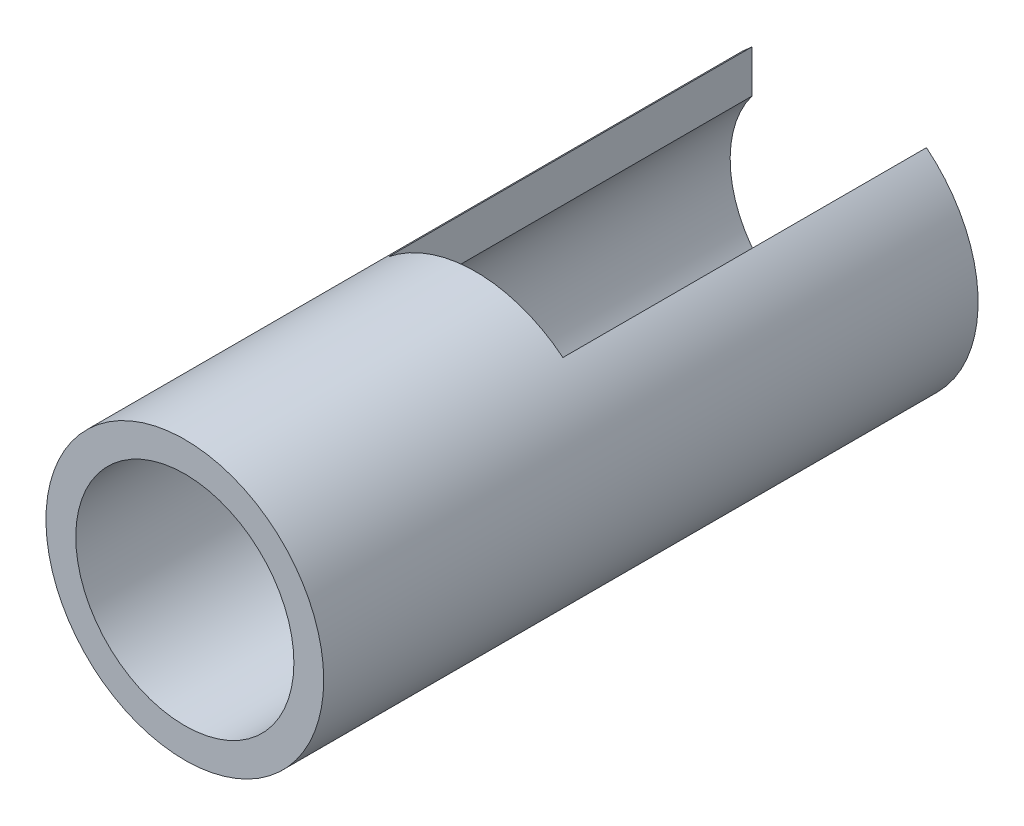
ISO-10303-21;
HEADER;
FILE_DESCRIPTION(('STEP AP214'),'2;1');
FILE_NAME('part.step','',(''),(''),'','','');
FILE_SCHEMA(('AUTOMOTIVE_DESIGN { 1 0 10303 214 1 1 1 1 }'));
ENDSEC;
DATA;
#1=APPLICATION_CONTEXT('core data for automotive mechanical design processes');
#2=APPLICATION_PROTOCOL_DEFINITION('international standard','automotive_design',2000,#1);
#3=PRODUCT_CONTEXT('',#1,'mechanical');
#4=PRODUCT('Part','Part','',(#3));
#5=PRODUCT_RELATED_PRODUCT_CATEGORY('part','',(#4));
#6=PRODUCT_DEFINITION_FORMATION('','',#4);
#7=PRODUCT_DEFINITION_CONTEXT('part definition',#1,'design');
#8=PRODUCT_DEFINITION('design','',#6,#7);
#9=PRODUCT_DEFINITION_SHAPE('','',#8);
#10=(LENGTH_UNIT() NAMED_UNIT(*) SI_UNIT(.MILLI.,.METRE.));
#11=(NAMED_UNIT(*) PLANE_ANGLE_UNIT() SI_UNIT($,.RADIAN.));
#12=(NAMED_UNIT(*) SI_UNIT($,.STERADIAN.) SOLID_ANGLE_UNIT());
#13=UNCERTAINTY_MEASURE_WITH_UNIT(LENGTH_MEASURE(1.E-05),#10,'distance_accuracy_value','');
#14=(GEOMETRIC_REPRESENTATION_CONTEXT(3) GLOBAL_UNCERTAINTY_ASSIGNED_CONTEXT((#13)) GLOBAL_UNIT_ASSIGNED_CONTEXT((#10,
#11,#12)) REPRESENTATION_CONTEXT('',''));
#15=CARTESIAN_POINT('',(0.,0.,0.));
#16=DIRECTION('',(0.,0.,1.));
#17=DIRECTION('',(1.,0.,0.));
#18=AXIS2_PLACEMENT_3D('',#15,#16,#17);
#19=CARTESIAN_POINT('',(0.,0.,0.));
#20=DIRECTION('',(0.,0.,1.));
#21=DIRECTION('',(1.,0.,0.));
#22=AXIS2_PLACEMENT_3D('',#19,#20,#21);
#23=PLANE('',#22);
#24=DIRECTION('',(0.,-1.,0.));
#25=VECTOR('',#24,1.);
#26=CARTESIAN_POINT('',(15.24,24.257,0.));
#27=LINE('',#26,#25);
#28=CARTESIAN_POINT('',(15.24,18.8717897667391,0.));
#29=VERTEX_POINT('',#28);
#30=CARTESIAN_POINT('',(15.24,11.43,0.));
#31=VERTEX_POINT('',#30);
#32=EDGE_CURVE('E55',#29,#31,#27,.T.);
#33=ORIENTED_EDGE('',*,*,#32,.F.);
#34=CARTESIAN_POINT('',(0.,0.,0.));
#35=DIRECTION('',(0.,0.,1.));
#36=DIRECTION('',(1.,0.,0.));
#37=AXIS2_PLACEMENT_3D('',#34,#35,#36);
#38=CIRCLE('',#37,24.257);
#39=CARTESIAN_POINT('',(-15.24,18.8717897667391,0.));
#40=VERTEX_POINT('',#39);
#41=EDGE_CURVE('E101',#40,#29,#38,.T.);
#42=ORIENTED_EDGE('',*,*,#41,.F.);
#43=DIRECTION('',(0.,-1.,0.));
#44=VECTOR('',#43,1.);
#45=CARTESIAN_POINT('',(-15.24,24.257,0.));
#46=LINE('',#45,#44);
#47=CARTESIAN_POINT('',(-15.24,11.43,0.));
#48=VERTEX_POINT('',#47);
#49=EDGE_CURVE('E79',#40,#48,#46,.T.);
#50=ORIENTED_EDGE('',*,*,#49,.T.);
#51=CARTESIAN_POINT('',(0.,0.,0.));
#52=DIRECTION('',(0.,0.,1.));
#53=DIRECTION('',(1.,0.,0.));
#54=AXIS2_PLACEMENT_3D('',#51,#52,#53);
#55=CIRCLE('',#54,19.05);
#56=EDGE_CURVE('E97',#48,#31,#55,.T.);
#57=ORIENTED_EDGE('',*,*,#56,.T.);
#58=EDGE_LOOP('',(#33,#42,#50,#57));
#59=FACE_BOUND('',#58,.T.);
#60=ADVANCED_FACE('F33',(#59),#23,.F.);
#61=CARTESIAN_POINT('',(0.,0.,114.3));
#62=DIRECTION('',(0.,0.,-1.));
#63=DIRECTION('',(-1.,0.,0.));
#64=AXIS2_PLACEMENT_3D('',#61,#62,#63);
#65=CYLINDRICAL_SURFACE('',#64,24.257);
#66=CARTESIAN_POINT('',(0.,0.,114.3));
#67=DIRECTION('',(0.,0.,1.));
#68=DIRECTION('',(1.,0.,0.));
#69=AXIS2_PLACEMENT_3D('',#66,#67,#68);
#70=CIRCLE('',#69,24.257);
#71=CARTESIAN_POINT('',(24.257,0.,114.3));
#72=VERTEX_POINT('',#71);
#73=EDGE_CURVE('E104',#72,#72,#70,.T.);
#74=ORIENTED_EDGE('',*,*,#73,.F.);
#75=EDGE_LOOP('',(#74));
#76=FACE_BOUND('',#75,.T.);
#77=DIRECTION('',(0.,0.,-1.));
#78=VECTOR('',#77,1.);
#79=CARTESIAN_POINT('',(-15.24,18.8717897667391,114.3));
#80=LINE('',#79,#78);
#81=CARTESIAN_POINT('',(-15.24,18.8717897667391,63.5));
#82=VERTEX_POINT('',#81);
#83=EDGE_CURVE('E73',#40,#82,#80,.F.);
#84=ORIENTED_EDGE('',*,*,#83,.F.);
#85=ORIENTED_EDGE('',*,*,#41,.T.);
#86=DIRECTION('',(0.,0.,-1.));
#87=VECTOR('',#86,1.);
#88=CARTESIAN_POINT('',(15.24,18.8717897667391,114.3));
#89=LINE('',#88,#87);
#90=CARTESIAN_POINT('',(15.24,18.8717897667391,63.5));
#91=VERTEX_POINT('',#90);
#92=EDGE_CURVE('E84',#91,#29,#89,.T.);
#93=ORIENTED_EDGE('',*,*,#92,.F.);
#94=CARTESIAN_POINT('',(0.,0.,63.5));
#95=DIRECTION('',(0.,0.,-1.));
#96=DIRECTION('',(-1.,0.,0.));
#97=AXIS2_PLACEMENT_3D('',#94,#95,#96);
#98=CIRCLE('',#97,24.257);
#99=EDGE_CURVE('E85',#82,#91,#98,.T.);
#100=ORIENTED_EDGE('',*,*,#99,.F.);
#101=EDGE_LOOP('',(#84,#85,#93,#100));
#102=FACE_BOUND('',#101,.T.);
#103=ADVANCED_FACE('F35',(#76,#102),#65,.T.);
#104=CARTESIAN_POINT('',(0.,0.,114.3));
#105=DIRECTION('',(0.,0.,-1.));
#106=DIRECTION('',(-1.,0.,0.));
#107=AXIS2_PLACEMENT_3D('',#104,#105,#106);
#108=CYLINDRICAL_SURFACE('',#107,19.05);
#109=CARTESIAN_POINT('',(0.,0.,114.3));
#110=DIRECTION('',(0.,0.,1.));
#111=DIRECTION('',(1.,0.,0.));
#112=AXIS2_PLACEMENT_3D('',#109,#110,#111);
#113=CIRCLE('',#112,19.05);
#114=CARTESIAN_POINT('',(19.05,0.,114.3));
#115=VERTEX_POINT('',#114);
#116=EDGE_CURVE('E98',#115,#115,#113,.T.);
#117=ORIENTED_EDGE('',*,*,#116,.T.);
#118=EDGE_LOOP('',(#117));
#119=FACE_BOUND('',#118,.T.);
#120=CARTESIAN_POINT('',(0.,0.,63.5));
#121=DIRECTION('',(0.,0.,-1.));
#122=DIRECTION('',(-1.,0.,0.));
#123=AXIS2_PLACEMENT_3D('',#120,#121,#122);
#124=CIRCLE('',#123,19.05);
#125=CARTESIAN_POINT('',(-15.24,11.43,63.5));
#126=VERTEX_POINT('',#125);
#127=CARTESIAN_POINT('',(15.24,11.43,63.5));
#128=VERTEX_POINT('',#127);
#129=EDGE_CURVE('E89',#126,#128,#124,.T.);
#130=ORIENTED_EDGE('',*,*,#129,.T.);
#131=DIRECTION('',(0.,0.,-1.));
#132=VECTOR('',#131,1.);
#133=CARTESIAN_POINT('',(15.24,11.43,114.3));
#134=LINE('',#133,#132);
#135=EDGE_CURVE('E11',#128,#31,#134,.T.);
#136=ORIENTED_EDGE('',*,*,#135,.T.);
#137=ORIENTED_EDGE('',*,*,#56,.F.);
#138=DIRECTION('',(0.,0.,-1.));
#139=VECTOR('',#138,1.);
#140=CARTESIAN_POINT('',(-15.24,11.43,114.3));
#141=LINE('',#140,#139);
#142=EDGE_CURVE('E41',#48,#126,#141,.F.);
#143=ORIENTED_EDGE('',*,*,#142,.T.);
#144=EDGE_LOOP('',(#130,#136,#137,#143));
#145=FACE_BOUND('',#144,.T.);
#146=ADVANCED_FACE('F110',(#119,#145),#108,.F.);
#147=CARTESIAN_POINT('',(0.,0.,114.3));
#148=DIRECTION('',(0.,0.,1.));
#149=DIRECTION('',(1.,0.,0.));
#150=AXIS2_PLACEMENT_3D('',#147,#148,#149);
#151=PLANE('',#150);
#152=ORIENTED_EDGE('',*,*,#73,.T.);
#153=EDGE_LOOP('',(#152));
#154=FACE_BOUND('',#153,.T.);
#155=ORIENTED_EDGE('',*,*,#116,.F.);
#156=EDGE_LOOP('',(#155));
#157=FACE_BOUND('',#156,.T.);
#158=ADVANCED_FACE('F119',(#154,#157),#151,.T.);
#159=CARTESIAN_POINT('',(15.24,24.257,63.5));
#160=DIRECTION('',(-1.,0.,0.));
#161=DIRECTION('',(0.,0.,1.));
#162=AXIS2_PLACEMENT_3D('',#159,#160,#161);
#163=PLANE('',#162);
#164=ORIENTED_EDGE('',*,*,#92,.T.);
#165=ORIENTED_EDGE('',*,*,#32,.T.);
#166=ORIENTED_EDGE('',*,*,#135,.F.);
#167=DIRECTION('',(0.,-1.,0.));
#168=VECTOR('',#167,1.);
#169=CARTESIAN_POINT('',(15.24,24.257,63.5));
#170=LINE('',#169,#168);
#171=EDGE_CURVE('E48',#91,#128,#170,.T.);
#172=ORIENTED_EDGE('',*,*,#171,.F.);
#173=EDGE_LOOP('',(#164,#165,#166,#172));
#174=FACE_BOUND('',#173,.T.);
#175=ADVANCED_FACE('F122',(#174),#163,.T.);
#176=CARTESIAN_POINT('',(-15.24,24.257,63.5));
#177=DIRECTION('',(1.,0.,0.));
#178=DIRECTION('',(0.,0.,-1.));
#179=AXIS2_PLACEMENT_3D('',#176,#177,#178);
#180=PLANE('',#179);
#181=ORIENTED_EDGE('',*,*,#83,.T.);
#182=DIRECTION('',(0.,-1.,0.));
#183=VECTOR('',#182,1.);
#184=CARTESIAN_POINT('',(-15.24,24.257,63.5));
#185=LINE('',#184,#183);
#186=EDGE_CURVE('E76',#82,#126,#185,.T.);
#187=ORIENTED_EDGE('',*,*,#186,.T.);
#188=ORIENTED_EDGE('',*,*,#142,.F.);
#189=ORIENTED_EDGE('',*,*,#49,.F.);
#190=EDGE_LOOP('',(#181,#187,#188,#189));
#191=FACE_BOUND('',#190,.T.);
#192=ADVANCED_FACE('F75',(#191),#180,.T.);
#193=CARTESIAN_POINT('',(-15.24,24.257,63.5));
#194=DIRECTION('',(0.,0.,-1.));
#195=DIRECTION('',(-1.,0.,0.));
#196=AXIS2_PLACEMENT_3D('',#193,#194,#195);
#197=PLANE('',#196);
#198=ORIENTED_EDGE('',*,*,#99,.T.);
#199=ORIENTED_EDGE('',*,*,#171,.T.);
#200=ORIENTED_EDGE('',*,*,#129,.F.);
#201=ORIENTED_EDGE('',*,*,#186,.F.);
#202=EDGE_LOOP('',(#198,#199,#200,#201));
#203=FACE_BOUND('',#202,.T.);
#204=ADVANCED_FACE('F87',(#203),#197,.T.);
#205=CLOSED_SHELL('',(#60,#103,#146,#158,#175,#192,#204));
#206=MANIFOLD_SOLID_BREP('B2',#205);
#207=ADVANCED_BREP_SHAPE_REPRESENTATION('',(#18,#206),#14);
#208=SHAPE_DEFINITION_REPRESENTATION(#9,#207);
ENDSEC;
END-ISO-10303-21;
